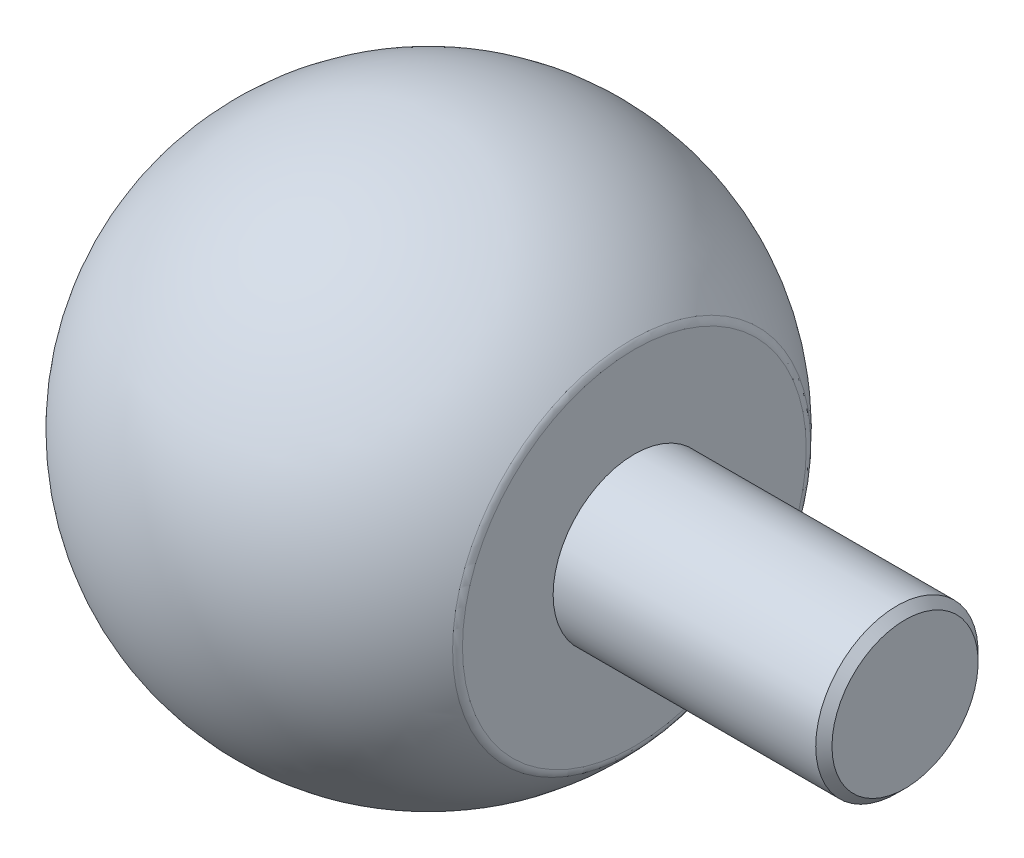
ISO-10303-21;
HEADER;
FILE_DESCRIPTION(('STEP AP214'),'2;1');
FILE_NAME('part.step','',(''),(''),'','','');
FILE_SCHEMA(('AUTOMOTIVE_DESIGN { 1 0 10303 214 1 1 1 1 }'));
ENDSEC;
DATA;
#1=APPLICATION_CONTEXT('core data for automotive mechanical design processes');
#2=APPLICATION_PROTOCOL_DEFINITION('international standard','automotive_design',2000,#1);
#3=PRODUCT_CONTEXT('',#1,'mechanical');
#4=PRODUCT('Part','Part','',(#3));
#5=PRODUCT_RELATED_PRODUCT_CATEGORY('part','',(#4));
#6=PRODUCT_DEFINITION_FORMATION('','',#4);
#7=PRODUCT_DEFINITION_CONTEXT('part definition',#1,'design');
#8=PRODUCT_DEFINITION('design','',#6,#7);
#9=PRODUCT_DEFINITION_SHAPE('','',#8);
#10=(LENGTH_UNIT() NAMED_UNIT(*) SI_UNIT(.MILLI.,.METRE.));
#11=(NAMED_UNIT(*) PLANE_ANGLE_UNIT() SI_UNIT($,.RADIAN.));
#12=(NAMED_UNIT(*) SI_UNIT($,.STERADIAN.) SOLID_ANGLE_UNIT());
#13=UNCERTAINTY_MEASURE_WITH_UNIT(LENGTH_MEASURE(1.E-05),#10,'distance_accuracy_value','');
#14=(GEOMETRIC_REPRESENTATION_CONTEXT(3) GLOBAL_UNCERTAINTY_ASSIGNED_CONTEXT((#13)) GLOBAL_UNIT_ASSIGNED_CONTEXT((#10,
#11,#12)) REPRESENTATION_CONTEXT('',''));
#15=CARTESIAN_POINT('',(0.,0.,0.));
#16=DIRECTION('',(0.,0.,1.));
#17=DIRECTION('',(1.,0.,0.));
#18=AXIS2_PLACEMENT_3D('',#15,#16,#17);
#19=CARTESIAN_POINT('',(3.8,0.,0.));
#20=DIRECTION('',(1.,0.,0.));
#21=DIRECTION('',(0.,0.,-1.));
#22=AXIS2_PLACEMENT_3D('',#19,#20,#21);
#23=PLANE('',#22);
#24=CARTESIAN_POINT('',(3.8,0.,0.));
#25=DIRECTION('',(1.,0.,0.));
#26=DIRECTION('',(0.,0.,-1.));
#27=AXIS2_PLACEMENT_3D('',#24,#25,#26);
#28=CIRCLE('',#27,3.17490157327751);
#29=CARTESIAN_POINT('',(3.8,0.,-3.17490157327751));
#30=VERTEX_POINT('',#29);
#31=EDGE_CURVE('E71',#30,#30,#28,.T.);
#32=ORIENTED_EDGE('',*,*,#31,.T.);
#33=EDGE_LOOP('',(#32));
#34=FACE_BOUND('',#33,.T.);
#35=CARTESIAN_POINT('',(3.8,0.,0.));
#36=DIRECTION('',(1.,0.,0.));
#37=DIRECTION('',(0.,0.,-1.));
#38=AXIS2_PLACEMENT_3D('',#35,#36,#37);
#39=CIRCLE('',#38,1.5);
#40=CARTESIAN_POINT('',(3.8,0.,-1.5));
#41=VERTEX_POINT('',#40);
#42=EDGE_CURVE('E65',#41,#41,#39,.T.);
#43=ORIENTED_EDGE('',*,*,#42,.F.);
#44=EDGE_LOOP('',(#43));
#45=FACE_BOUND('',#44,.T.);
#46=ADVANCED_FACE('F38',(#34,#45),#23,.T.);
#47=CARTESIAN_POINT('',(0.,0.,0.));
#48=DIRECTION('',(0.,1.,0.));
#49=DIRECTION('',(1.,0.,0.));
#50=AXIS2_PLACEMENT_3D('',#47,#48,#49);
#51=SPHERICAL_SURFACE('',#50,5.);
#52=CARTESIAN_POINT('',(3.75,0.,0.));
#53=DIRECTION('',(-1.,0.,0.));
#54=DIRECTION('',(0.,0.,1.));
#55=AXIS2_PLACEMENT_3D('',#52,#53,#54);
#56=CIRCLE('',#55,3.30718913883074);
#57=CARTESIAN_POINT('',(3.75,0.,3.30718913883074));
#58=VERTEX_POINT('',#57);
#59=EDGE_CURVE('E74',#58,#58,#56,.T.);
#60=ORIENTED_EDGE('',*,*,#59,.T.);
#61=EDGE_LOOP('',(#60));
#62=FACE_BOUND('',#61,.T.);
#63=CARTESIAN_POINT('',(-0.307643957366828,-4.57223743866126,0.));
#64=DIRECTION('',(0.0671334153204408,0.997744007522677,0.));
#65=DIRECTION('',(-0.997744007522678,0.0671334153204409,0.));
#66=AXIS2_PLACEMENT_3D('',#63,#64,#65);
#67=CIRCLE('',#66,2.);
#68=CARTESIAN_POINT('',(1.68784405767853,-4.70650426930214,0.));
#69=VERTEX_POINT('',#68);
#70=EDGE_CURVE('E58',#69,#69,#67,.T.);
#71=ORIENTED_EDGE('',*,*,#70,.T.);
#72=EDGE_LOOP('',(#71));
#73=FACE_BOUND('',#72,.T.);
#74=ADVANCED_FACE('F90',(#62,#73),#51,.T.);
#75=CARTESIAN_POINT('',(-0.302813805104316,-4.50045119849547,0.));
#76=DIRECTION('',(-0.0671334153204408,-0.997744007522678,0.));
#77=DIRECTION('',(0.997744007522678,-0.0671334153204408,0.));
#78=AXIS2_PLACEMENT_3D('',#75,#76,#77);
#79=CYLINDRICAL_SURFACE('',#78,2.);
#80=CARTESIAN_POINT('',(-0.302813805104316,-4.50045119849547,0.));
#81=DIRECTION('',(-0.0671334153204409,-0.997744007522678,0.));
#82=DIRECTION('',(0.997744007522678,-0.0671334153204409,0.));
#83=AXIS2_PLACEMENT_3D('',#80,#81,#82);
#84=CIRCLE('',#83,2.);
#85=CARTESIAN_POINT('',(1.69267420994104,-4.63471802913635,0.));
#86=VERTEX_POINT('',#85);
#87=EDGE_CURVE('E62',#86,#86,#84,.T.);
#88=CARTESIAN_POINT('',(1.69267420994104,-4.63471802913635,0.));
#89=CARTESIAN_POINT('',(1.69262389585497,-4.63546580247141,0.));
#90=CARTESIAN_POINT('',(1.6925735817689,-4.63621357580647,0.));
#91=CARTESIAN_POINT('',(1.69247295359677,-4.63770912247659,0.));
#92=CARTESIAN_POINT('',(1.6924226395107,-4.63845689581165,0.));
#93=CARTESIAN_POINT('',(1.69232201133856,-4.63995244248177,0.));
#94=CARTESIAN_POINT('',(1.6922716972525,-4.64070021581683,0.));
#95=CARTESIAN_POINT('',(1.69217106908036,-4.64219576248695,0.));
#96=CARTESIAN_POINT('',(1.69212075499429,-4.64294353582201,0.));
#97=CARTESIAN_POINT('',(1.69202012682216,-4.64443908249213,0.));
#98=CARTESIAN_POINT('',(1.69196981273609,-4.64518685582719,0.));
#99=CARTESIAN_POINT('',(1.69186918456395,-4.64668240249731,0.));
#100=CARTESIAN_POINT('',(1.69181887047789,-4.64743017583237,0.));
#101=CARTESIAN_POINT('',(1.69171824230575,-4.6489257225025,0.));
#102=CARTESIAN_POINT('',(1.69166792821968,-4.64967349583755,0.));
#103=CARTESIAN_POINT('',(1.69156730004755,-4.65116904250768,0.));
#104=CARTESIAN_POINT('',(1.69151698596148,-4.65191681584274,0.));
#105=CARTESIAN_POINT('',(1.69141635778934,-4.65341236251286,0.));
#106=CARTESIAN_POINT('',(1.69136604370328,-4.65416013584792,0.));
#107=CARTESIAN_POINT('',(1.69126541553114,-4.65565568251804,0.));
#108=CARTESIAN_POINT('',(1.69121510144507,-4.6564034558531,0.));
#109=CARTESIAN_POINT('',(1.69111447327294,-4.65789900252322,0.));
#110=CARTESIAN_POINT('',(1.69106415918687,-4.65864677585828,0.));
#111=CARTESIAN_POINT('',(1.69096353101473,-4.6601423225284,0.));
#112=CARTESIAN_POINT('',(1.69091321692867,-4.66089009586346,0.));
#113=CARTESIAN_POINT('',(1.69081258875653,-4.66238564253358,0.));
#114=CARTESIAN_POINT('',(1.69076227467046,-4.66313341586864,0.));
#115=CARTESIAN_POINT('',(1.69066164649833,-4.66462896253876,0.));
#116=CARTESIAN_POINT('',(1.69061133241226,-4.66537673587382,0.));
#117=CARTESIAN_POINT('',(1.69051070424012,-4.66687228254394,0.));
#118=CARTESIAN_POINT('',(1.69046039015405,-4.667620055879,0.));
#119=CARTESIAN_POINT('',(1.69035976198192,-4.66911560254912,0.));
#120=CARTESIAN_POINT('',(1.69030944789585,-4.66986337588418,0.));
#121=CARTESIAN_POINT('',(1.69020881972372,-4.67135892255431,0.));
#122=CARTESIAN_POINT('',(1.69015850563765,-4.67210669588937,0.));
#123=CARTESIAN_POINT('',(1.69005787746551,-4.67360224255949,0.));
#124=CARTESIAN_POINT('',(1.69000756337944,-4.67435001589455,0.));
#125=CARTESIAN_POINT('',(1.68990693520731,-4.67584556256467,0.));
#126=CARTESIAN_POINT('',(1.68985662112124,-4.67659333589973,0.));
#127=CARTESIAN_POINT('',(1.68975599294911,-4.67808888256985,0.));
#128=CARTESIAN_POINT('',(1.68970567886304,-4.67883665590491,0.));
#129=CARTESIAN_POINT('',(1.6896050506909,-4.68033220257503,0.));
#130=CARTESIAN_POINT('',(1.68955473660483,-4.68107997591009,0.));
#131=CARTESIAN_POINT('',(1.6894541084327,-4.68257552258021,0.));
#132=CARTESIAN_POINT('',(1.68940379434663,-4.68332329591527,0.));
#133=CARTESIAN_POINT('',(1.68930316617449,-4.68481884258539,0.));
#134=CARTESIAN_POINT('',(1.68925285208843,-4.68556661592045,0.));
#135=CARTESIAN_POINT('',(1.68915222391629,-4.68706216259057,0.));
#136=CARTESIAN_POINT('',(1.68910190983022,-4.68780993592563,0.));
#137=CARTESIAN_POINT('',(1.68900128165809,-4.68930548259575,0.));
#138=CARTESIAN_POINT('',(1.68895096757202,-4.69005325593081,0.));
#139=CARTESIAN_POINT('',(1.68885033939988,-4.69154880260094,0.));
#140=CARTESIAN_POINT('',(1.68880002531382,-4.692296575936,0.));
#141=CARTESIAN_POINT('',(1.68869939714168,-4.69379212260612,0.));
#142=CARTESIAN_POINT('',(1.68864908305561,-4.69453989594118,0.));
#143=CARTESIAN_POINT('',(1.68854845488348,-4.6960354426113,0.));
#144=CARTESIAN_POINT('',(1.68849814079741,-4.69678321594636,0.));
#145=CARTESIAN_POINT('',(1.68839751262527,-4.69827876261648,0.));
#146=CARTESIAN_POINT('',(1.68834719853921,-4.69902653595154,0.));
#147=CARTESIAN_POINT('',(1.68824657036707,-4.70052208262166,0.));
#148=CARTESIAN_POINT('',(1.688196256281,-4.70126985595672,0.));
#149=CARTESIAN_POINT('',(1.68809562810887,-4.70276540262684,0.));
#150=CARTESIAN_POINT('',(1.6880453140228,-4.7035131759619,0.));
#151=CARTESIAN_POINT('',(1.68794468585066,-4.70500872263202,0.));
#152=CARTESIAN_POINT('',(1.6878943717646,-4.70575649596708,0.));
#153=CARTESIAN_POINT('',(1.68784405767853,-4.70650426930214,0.));
#154=B_SPLINE_CURVE_WITH_KNOTS('',3,(#88,#89,#90,#91,#92,#93,#94,#95,#96,#97,#98,#99,#100,#101,
#102,#103,#104,#105,#106,#107,#108,#109,#110,#111,#112,#113,#114,#115,#116,#117,#118,#119,#120,
#121,#122,#123,#124,#125,#126,#127,#128,#129,#130,#131,#132,#133,#134,#135,#136,#137,#138,#139,
#140,#141,#142,#143,#144,#145,#146,#147,#148,#149,#150,#151,#152,#153),.UNSPECIFIED.,.F.,.F.,(4,
2,2,2,2,2,2,2,2,2,2,2,2,2,2,2,2,2,2,2,2,2,2,2,2,2,2,2,2,2,2,2,4),(0.,0.00224839236143454,
0.00449678472286908,0.00674517708430361,0.00899356944573815,0.0112419618071727,
0.0134903541686072,0.0157387465300417,0.0179871388914763,0.0202355312529108,0.0224839236143454,
0.0247323159757799,0.0269807083372144,0.029229100698649,0.0314774930600835,0.033725885421518,
0.0359742777829526,0.0382226701443871,0.0404710625058216,0.0427194548672562,0.0449678472286907,
0.0472162395901253,0.0494646319515598,0.0517130243129943,0.0539614166744289,0.0562098090358634,
0.0584582013972979,0.0607065937587325,0.062954986120167,0.0652033784816015,0.0674517708430361,
0.0697001632044706,0.071948555565906),.UNSPECIFIED.);
#155=EDGE_CURVE('BSEAM96',#86,#69,#154,.T.);
#156=ORIENTED_EDGE('',*,*,#87,.F.);
#157=ORIENTED_EDGE('',*,*,#70,.F.);
#158=ORIENTED_EDGE('',*,*,#155,.T.);
#159=ORIENTED_EDGE('',*,*,#155,.F.);
#160=EDGE_LOOP('',(#156,#158,#157,#159));
#161=FACE_BOUND('',#160,.T.);
#162=ADVANCED_FACE('F96',(#161),#79,.F.);
#163=CARTESIAN_POINT('',(-0.302813805104316,-4.50045119849547,0.));
#164=DIRECTION('',(-0.0671334153204409,-0.997744007522678,0.));
#165=DIRECTION('',(0.997744007522678,-0.0671334153204409,0.));
#166=AXIS2_PLACEMENT_3D('',#163,#164,#165);
#167=PLANE('',#166);
#168=CARTESIAN_POINT('',(-0.302813805104317,-4.50045119849547,0.));
#169=DIRECTION('',(-0.0671334153204409,-0.997744007522678,0.));
#170=DIRECTION('',(0.997744007522678,-0.0671334153204409,0.));
#171=AXIS2_PLACEMENT_3D('',#168,#169,#170);
#172=CIRCLE('',#171,1.24999999999999);
#173=CARTESIAN_POINT('',(0.94436620429902,-4.58436796764602,0.));
#174=VERTEX_POINT('',#173);
#175=EDGE_CURVE('E59',#174,#174,#172,.T.);
#176=ORIENTED_EDGE('',*,*,#175,.F.);
#177=EDGE_LOOP('',(#176));
#178=FACE_BOUND('',#177,.T.);
#179=ORIENTED_EDGE('',*,*,#87,.T.);
#180=EDGE_LOOP('',(#179));
#181=FACE_BOUND('',#180,.T.);
#182=ADVANCED_FACE('F52',(#178,#181),#167,.T.);
#183=CARTESIAN_POINT('',(0.0664199791581087,0.987140842879269,0.));
#184=DIRECTION('',(-0.0671334153204409,-0.997744007522678,0.));
#185=DIRECTION('',(0.997744007522678,-0.0671334153204409,0.));
#186=AXIS2_PLACEMENT_3D('',#183,#184,#185);
#187=CONICAL_SURFACE('',#186,1.24999999999999,1.02974425867665);
#188=CARTESIAN_POINT('',(0.116842261016701,1.73652219536815,0.));
#189=VERTEX_POINT('',#188);
#190=VERTEX_LOOP('',#189);
#191=FACE_BOUND('',#190,.T.);
#192=CARTESIAN_POINT('',(0.0664199791581087,0.987140842879269,0.));
#193=DIRECTION('',(-0.0671334153204409,-0.997744007522678,0.));
#194=DIRECTION('',(0.997744007522678,-0.0671334153204409,0.));
#195=AXIS2_PLACEMENT_3D('',#192,#193,#194);
#196=CIRCLE('',#195,1.24999999999999);
#197=CARTESIAN_POINT('',(1.31359998856144,0.903224073728719,0.));
#198=VERTEX_POINT('',#197);
#199=EDGE_CURVE('E56',#198,#198,#196,.T.);
#200=ORIENTED_EDGE('',*,*,#199,.T.);
#201=EDGE_LOOP('',(#200));
#202=FACE_BOUND('',#201,.T.);
#203=ADVANCED_FACE('F48',(#191,#202),#187,.F.);
#204=CARTESIAN_POINT('',(-0.302813805104316,-4.50045119849547,0.));
#205=DIRECTION('',(-0.0671334153204409,-0.997744007522678,0.));
#206=DIRECTION('',(0.997744007522678,-0.0671334153204409,0.));
#207=AXIS2_PLACEMENT_3D('',#204,#205,#206);
#208=CYLINDRICAL_SURFACE('',#207,1.24999999999999);
#209=ORIENTED_EDGE('',*,*,#199,.F.);
#210=EDGE_LOOP('',(#209));
#211=FACE_BOUND('',#210,.T.);
#212=ORIENTED_EDGE('',*,*,#175,.T.);
#213=EDGE_LOOP('',(#212));
#214=FACE_BOUND('',#213,.T.);
#215=ADVANCED_FACE('F51',(#211,#214),#208,.F.);
#216=CARTESIAN_POINT('',(8.8,0.,0.));
#217=DIRECTION('',(-1.,0.,0.));
#218=DIRECTION('',(0.,0.,1.));
#219=AXIS2_PLACEMENT_3D('',#216,#217,#218);
#220=CYLINDRICAL_SURFACE('',#219,1.5);
#221=CARTESIAN_POINT('',(8.65,0.,0.));
#222=DIRECTION('',(1.,0.,0.));
#223=DIRECTION('',(0.,0.,-1.));
#224=AXIS2_PLACEMENT_3D('',#221,#222,#223);
#225=CIRCLE('',#224,1.5);
#226=CARTESIAN_POINT('',(8.65,0.,1.5));
#227=VERTEX_POINT('',#226);
#228=EDGE_CURVE('E11',#227,#227,#225,.F.);
#229=ORIENTED_EDGE('',*,*,#228,.T.);
#230=EDGE_LOOP('',(#229));
#231=FACE_BOUND('',#230,.T.);
#232=ORIENTED_EDGE('',*,*,#42,.T.);
#233=EDGE_LOOP('',(#232));
#234=FACE_BOUND('',#233,.T.);
#235=ADVANCED_FACE('F102',(#231,#234),#220,.T.);
#236=CARTESIAN_POINT('',(8.8,0.,0.));
#237=DIRECTION('',(1.,0.,0.));
#238=DIRECTION('',(0.,0.,-1.));
#239=AXIS2_PLACEMENT_3D('',#236,#237,#238);
#240=PLANE('',#239);
#241=CARTESIAN_POINT('',(8.8,0.,0.));
#242=DIRECTION('',(1.,0.,0.));
#243=DIRECTION('',(0.,0.,-1.));
#244=AXIS2_PLACEMENT_3D('',#241,#242,#243);
#245=CIRCLE('',#244,1.35);
#246=CARTESIAN_POINT('',(8.8,0.,1.35));
#247=VERTEX_POINT('',#246);
#248=EDGE_CURVE('E45',#247,#247,#245,.T.);
#249=ORIENTED_EDGE('',*,*,#248,.T.);
#250=EDGE_LOOP('',(#249));
#251=FACE_BOUND('',#250,.T.);
#252=ADVANCED_FACE('F79',(#251),#240,.T.);
#253=CARTESIAN_POINT('',(3.6,0.,0.));
#254=DIRECTION('',(1.,0.,0.));
#255=DIRECTION('',(0.,0.,-1.));
#256=AXIS2_PLACEMENT_3D('',#253,#254,#255);
#257=TOROIDAL_SURFACE('',#256,3.17490157327751,0.2);
#258=ORIENTED_EDGE('',*,*,#59,.F.);
#259=EDGE_LOOP('',(#258));
#260=FACE_BOUND('',#259,.T.);
#261=ORIENTED_EDGE('',*,*,#31,.F.);
#262=EDGE_LOOP('',(#261));
#263=FACE_BOUND('',#262,.T.);
#264=ADVANCED_FACE('F82',(#260,#263),#257,.T.);
#265=CARTESIAN_POINT('',(8.8,0.,0.));
#266=DIRECTION('',(-1.,0.,0.));
#267=DIRECTION('',(0.,0.,1.));
#268=AXIS2_PLACEMENT_3D('',#265,#266,#267);
#269=CONICAL_SURFACE('',#268,1.35,0.78539816339745);
#270=CARTESIAN_POINT('',(8.65,0.,1.5));
#271=CARTESIAN_POINT('',(8.6515625,0.,1.4984375));
#272=CARTESIAN_POINT('',(8.653125,0.,1.496875));
#273=CARTESIAN_POINT('',(8.65625,0.,1.49375));
#274=CARTESIAN_POINT('',(8.6578125,0.,1.4921875));
#275=CARTESIAN_POINT('',(8.6609375,0.,1.4890625));
#276=CARTESIAN_POINT('',(8.6625,0.,1.4875));
#277=CARTESIAN_POINT('',(8.665625,0.,1.484375));
#278=CARTESIAN_POINT('',(8.6671875,0.,1.4828125));
#279=CARTESIAN_POINT('',(8.6703125,0.,1.4796875));
#280=CARTESIAN_POINT('',(8.671875,0.,1.478125));
#281=CARTESIAN_POINT('',(8.675,0.,1.475));
#282=CARTESIAN_POINT('',(8.6765625,0.,1.4734375));
#283=CARTESIAN_POINT('',(8.6796875,0.,1.4703125));
#284=CARTESIAN_POINT('',(8.68125,0.,1.46875));
#285=CARTESIAN_POINT('',(8.684375,0.,1.465625));
#286=CARTESIAN_POINT('',(8.6859375,0.,1.4640625));
#287=CARTESIAN_POINT('',(8.6890625,0.,1.4609375));
#288=CARTESIAN_POINT('',(8.690625,0.,1.459375));
#289=CARTESIAN_POINT('',(8.69375,0.,1.45625));
#290=CARTESIAN_POINT('',(8.6953125,0.,1.4546875));
#291=CARTESIAN_POINT('',(8.6984375,0.,1.4515625));
#292=CARTESIAN_POINT('',(8.7,0.,1.45));
#293=CARTESIAN_POINT('',(8.703125,0.,1.446875));
#294=CARTESIAN_POINT('',(8.7046875,0.,1.4453125));
#295=CARTESIAN_POINT('',(8.7078125,0.,1.4421875));
#296=CARTESIAN_POINT('',(8.709375,0.,1.440625));
#297=CARTESIAN_POINT('',(8.7125,0.,1.4375));
#298=CARTESIAN_POINT('',(8.7140625,0.,1.4359375));
#299=CARTESIAN_POINT('',(8.7171875,0.,1.4328125));
#300=CARTESIAN_POINT('',(8.71875,0.,1.43125));
#301=CARTESIAN_POINT('',(8.721875,0.,1.428125));
#302=CARTESIAN_POINT('',(8.7234375,0.,1.4265625));
#303=CARTESIAN_POINT('',(8.7265625,0.,1.4234375));
#304=CARTESIAN_POINT('',(8.728125,0.,1.421875));
#305=CARTESIAN_POINT('',(8.73125,0.,1.41875));
#306=CARTESIAN_POINT('',(8.7328125,0.,1.4171875));
#307=CARTESIAN_POINT('',(8.7359375,0.,1.4140625));
#308=CARTESIAN_POINT('',(8.7375,0.,1.4125));
#309=CARTESIAN_POINT('',(8.740625,0.,1.409375));
#310=CARTESIAN_POINT('',(8.7421875,0.,1.4078125));
#311=CARTESIAN_POINT('',(8.7453125,0.,1.4046875));
#312=CARTESIAN_POINT('',(8.746875,0.,1.403125));
#313=CARTESIAN_POINT('',(8.75,0.,1.4));
#314=CARTESIAN_POINT('',(8.7515625,0.,1.3984375));
#315=CARTESIAN_POINT('',(8.7546875,0.,1.3953125));
#316=CARTESIAN_POINT('',(8.75625,0.,1.39375));
#317=CARTESIAN_POINT('',(8.759375,0.,1.390625));
#318=CARTESIAN_POINT('',(8.7609375,0.,1.3890625));
#319=CARTESIAN_POINT('',(8.7640625,0.,1.3859375));
#320=CARTESIAN_POINT('',(8.765625,0.,1.384375));
#321=CARTESIAN_POINT('',(8.76875,0.,1.38125));
#322=CARTESIAN_POINT('',(8.7703125,0.,1.3796875));
#323=CARTESIAN_POINT('',(8.7734375,0.,1.3765625));
#324=CARTESIAN_POINT('',(8.775,0.,1.375));
#325=CARTESIAN_POINT('',(8.778125,0.,1.371875));
#326=CARTESIAN_POINT('',(8.7796875,0.,1.3703125));
#327=CARTESIAN_POINT('',(8.7828125,0.,1.3671875));
#328=CARTESIAN_POINT('',(8.784375,0.,1.365625));
#329=CARTESIAN_POINT('',(8.7875,0.,1.3625));
#330=CARTESIAN_POINT('',(8.7890625,0.,1.3609375));
#331=CARTESIAN_POINT('',(8.7921875,0.,1.3578125));
#332=CARTESIAN_POINT('',(8.79375,0.,1.35625));
#333=CARTESIAN_POINT('',(8.796875,0.,1.353125));
#334=CARTESIAN_POINT('',(8.7984375,0.,1.3515625));
#335=CARTESIAN_POINT('',(8.8,0.,1.35));
#336=B_SPLINE_CURVE_WITH_KNOTS('',3,(#270,#271,#272,#273,#274,#275,#276,#277,#278,#279,#280,
#281,#282,#283,#284,#285,#286,#287,#288,#289,#290,#291,#292,#293,#294,#295,#296,#297,#298,#299,
#300,#301,#302,#303,#304,#305,#306,#307,#308,#309,#310,#311,#312,#313,#314,#315,#316,#317,#318,
#319,#320,#321,#322,#323,#324,#325,#326,#327,#328,#329,#330,#331,#332,#333,#334,#335),
.UNSPECIFIED.,.F.,.F.,(4,2,2,2,2,2,2,2,2,2,2,2,2,2,2,2,2,2,2,2,2,2,2,2,2,2,2,2,2,2,2,2,4),(0.,
0.00662912607362484,0.0132582521472483,0.0198873782208731,0.0265165042944968,0.0331456303681204,
0.0397747564417452,0.0464038825153688,0.0530330085889924,0.0596621346626171,0.0662912607362407,
0.0729203868098643,0.0795495128834892,0.0861786389571128,0.0928077650307364,0.0994368911043612,
0.106066017177985,0.112695143251608,0.119324269325233,0.125953395398857,0.13258252147248,
0.139211647546105,0.145840773619729,0.152469899693352,0.159099025766977,0.165728151840601,
0.172357277914224,0.178986403987849,0.185615530061473,0.192244656135096,0.198873782208721,
0.205502908282345,0.21213203435597),.UNSPECIFIED.);
#337=EDGE_CURVE('BSEAM40',#227,#247,#336,.T.);
#338=ORIENTED_EDGE('',*,*,#228,.F.);
#339=ORIENTED_EDGE('',*,*,#248,.F.);
#340=ORIENTED_EDGE('',*,*,#337,.T.);
#341=ORIENTED_EDGE('',*,*,#337,.F.);
#342=EDGE_LOOP('',(#338,#340,#339,#341));
#343=FACE_BOUND('',#342,.T.);
#344=ADVANCED_FACE('F40',(#343),#269,.T.);
#345=CLOSED_SHELL('',(#46,#74,#162,#182,#203,#215,#235,#252,#264,#344));
#346=MANIFOLD_SOLID_BREP('B2',#345);
#347=ADVANCED_BREP_SHAPE_REPRESENTATION('',(#18,#346),#14);
#348=SHAPE_DEFINITION_REPRESENTATION(#9,#347);
ENDSEC;
END-ISO-10303-21;
